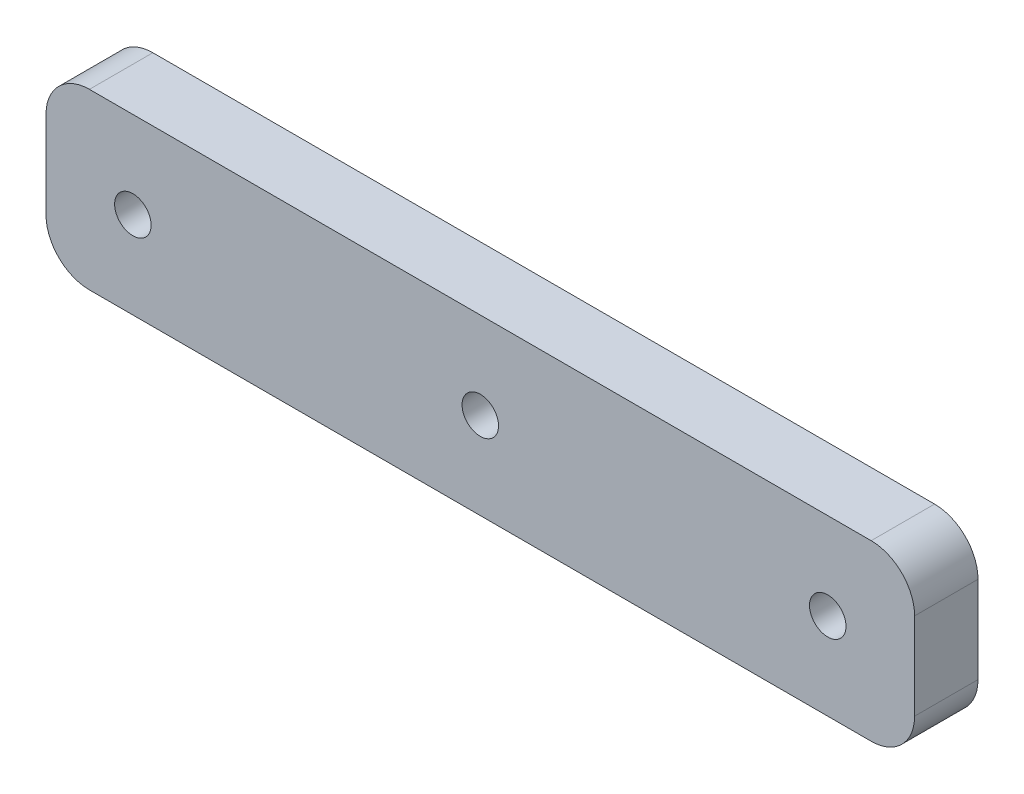
ISO-10303-21;
HEADER;
FILE_DESCRIPTION(('STEP AP214'),'2;1');
FILE_NAME('part.step','',(''),(''),'','','');
FILE_SCHEMA(('AUTOMOTIVE_DESIGN { 1 0 10303 214 1 1 1 1 }'));
ENDSEC;
DATA;
#1=APPLICATION_CONTEXT('core data for automotive mechanical design processes');
#2=APPLICATION_PROTOCOL_DEFINITION('international standard','automotive_design',2000,#1);
#3=PRODUCT_CONTEXT('',#1,'mechanical');
#4=PRODUCT('Part','Part','',(#3));
#5=PRODUCT_RELATED_PRODUCT_CATEGORY('part','',(#4));
#6=PRODUCT_DEFINITION_FORMATION('','',#4);
#7=PRODUCT_DEFINITION_CONTEXT('part definition',#1,'design');
#8=PRODUCT_DEFINITION('design','',#6,#7);
#9=PRODUCT_DEFINITION_SHAPE('','',#8);
#10=(LENGTH_UNIT() NAMED_UNIT(*) SI_UNIT(.MILLI.,.METRE.));
#11=(NAMED_UNIT(*) PLANE_ANGLE_UNIT() SI_UNIT($,.RADIAN.));
#12=(NAMED_UNIT(*) SI_UNIT($,.STERADIAN.) SOLID_ANGLE_UNIT());
#13=UNCERTAINTY_MEASURE_WITH_UNIT(LENGTH_MEASURE(1.E-05),#10,'distance_accuracy_value','');
#14=(GEOMETRIC_REPRESENTATION_CONTEXT(3) GLOBAL_UNCERTAINTY_ASSIGNED_CONTEXT((#13)) GLOBAL_UNIT_ASSIGNED_CONTEXT((#10,
#11,#12)) REPRESENTATION_CONTEXT('',''));
#15=CARTESIAN_POINT('',(0.,0.,0.));
#16=DIRECTION('',(0.,0.,1.));
#17=DIRECTION('',(1.,0.,0.));
#18=AXIS2_PLACEMENT_3D('',#15,#16,#17);
#19=CARTESIAN_POINT('',(0.,0.,7.3));
#20=DIRECTION('',(1.,0.,0.));
#21=DIRECTION('',(0.,0.,-1.));
#22=AXIS2_PLACEMENT_3D('',#19,#20,#21);
#23=PLANE('',#22);
#24=DIRECTION('',(0.,-1.,0.));
#25=VECTOR('',#24,1.);
#26=CARTESIAN_POINT('',(0.,0.,0.));
#27=LINE('',#26,#25);
#28=CARTESIAN_POINT('',(0.,15.,0.));
#29=VERTEX_POINT('',#28);
#30=CARTESIAN_POINT('',(0.,5.,0.));
#31=VERTEX_POINT('',#30);
#32=EDGE_CURVE('E165',#29,#31,#27,.T.);
#33=ORIENTED_EDGE('',*,*,#32,.T.);
#34=DIRECTION('',(0.,0.,-1.));
#35=VECTOR('',#34,1.);
#36=CARTESIAN_POINT('',(0.,5.,7.3));
#37=LINE('',#36,#35);
#38=CARTESIAN_POINT('',(0.,5.,7.3));
#39=VERTEX_POINT('',#38);
#40=EDGE_CURVE('E11',#31,#39,#37,.F.);
#41=ORIENTED_EDGE('',*,*,#40,.T.);
#42=DIRECTION('',(0.,-1.,0.));
#43=VECTOR('',#42,1.);
#44=CARTESIAN_POINT('',(0.,0.,7.3));
#45=LINE('',#44,#43);
#46=CARTESIAN_POINT('',(0.,15.,7.3));
#47=VERTEX_POINT('',#46);
#48=EDGE_CURVE('E133',#47,#39,#45,.T.);
#49=ORIENTED_EDGE('',*,*,#48,.F.);
#50=DIRECTION('',(0.,0.,-1.));
#51=VECTOR('',#50,1.);
#52=CARTESIAN_POINT('',(0.,15.,7.3));
#53=LINE('',#52,#51);
#54=EDGE_CURVE('E49',#47,#29,#53,.T.);
#55=ORIENTED_EDGE('',*,*,#54,.T.);
#56=EDGE_LOOP('',(#33,#41,#49,#55));
#57=FACE_BOUND('',#56,.T.);
#58=ADVANCED_FACE('F41',(#57),#23,.F.);
#59=CARTESIAN_POINT('',(0.,0.,7.3));
#60=DIRECTION('',(0.,1.,0.));
#61=DIRECTION('',(0.,0.,1.));
#62=AXIS2_PLACEMENT_3D('',#59,#60,#61);
#63=PLANE('',#62);
#64=DIRECTION('',(1.,0.,0.));
#65=VECTOR('',#64,1.);
#66=CARTESIAN_POINT('',(0.,0.,0.));
#67=LINE('',#66,#65);
#68=CARTESIAN_POINT('',(5.,0.,0.));
#69=VERTEX_POINT('',#68);
#70=CARTESIAN_POINT('',(95.,0.,0.));
#71=VERTEX_POINT('',#70);
#72=EDGE_CURVE('E138',#69,#71,#67,.T.);
#73=ORIENTED_EDGE('',*,*,#72,.T.);
#74=DIRECTION('',(0.,0.,-1.));
#75=VECTOR('',#74,1.);
#76=CARTESIAN_POINT('',(95.,0.,7.3));
#77=LINE('',#76,#75);
#78=CARTESIAN_POINT('',(95.,0.,7.3));
#79=VERTEX_POINT('',#78);
#80=EDGE_CURVE('E56',#71,#79,#77,.F.);
#81=ORIENTED_EDGE('',*,*,#80,.T.);
#82=DIRECTION('',(1.,0.,0.));
#83=VECTOR('',#82,1.);
#84=CARTESIAN_POINT('',(0.,0.,7.3));
#85=LINE('',#84,#83);
#86=CARTESIAN_POINT('',(5.,0.,7.3));
#87=VERTEX_POINT('',#86);
#88=EDGE_CURVE('E136',#87,#79,#85,.T.);
#89=ORIENTED_EDGE('',*,*,#88,.F.);
#90=DIRECTION('',(0.,0.,-1.));
#91=VECTOR('',#90,1.);
#92=CARTESIAN_POINT('',(5.,0.,7.3));
#93=LINE('',#92,#91);
#94=EDGE_CURVE('E157',#87,#69,#93,.T.);
#95=ORIENTED_EDGE('',*,*,#94,.T.);
#96=EDGE_LOOP('',(#73,#81,#89,#95));
#97=FACE_BOUND('',#96,.T.);
#98=ADVANCED_FACE('F212',(#97),#63,.F.);
#99=CARTESIAN_POINT('',(100.,0.,7.3));
#100=DIRECTION('',(-1.,0.,0.));
#101=DIRECTION('',(0.,0.,1.));
#102=AXIS2_PLACEMENT_3D('',#99,#100,#101);
#103=PLANE('',#102);
#104=DIRECTION('',(0.,1.,0.));
#105=VECTOR('',#104,1.);
#106=CARTESIAN_POINT('',(100.,0.,0.));
#107=LINE('',#106,#105);
#108=CARTESIAN_POINT('',(100.,5.,0.));
#109=VERTEX_POINT('',#108);
#110=CARTESIAN_POINT('',(100.,15.,0.));
#111=VERTEX_POINT('',#110);
#112=EDGE_CURVE('E134',#109,#111,#107,.T.);
#113=ORIENTED_EDGE('',*,*,#112,.T.);
#114=DIRECTION('',(0.,0.,-1.));
#115=VECTOR('',#114,1.);
#116=CARTESIAN_POINT('',(100.,15.,7.3));
#117=LINE('',#116,#115);
#118=CARTESIAN_POINT('',(100.,15.,7.3));
#119=VERTEX_POINT('',#118);
#120=EDGE_CURVE('E112',#111,#119,#117,.F.);
#121=ORIENTED_EDGE('',*,*,#120,.T.);
#122=DIRECTION('',(0.,1.,0.));
#123=VECTOR('',#122,1.);
#124=CARTESIAN_POINT('',(100.,0.,7.3));
#125=LINE('',#124,#123);
#126=CARTESIAN_POINT('',(100.,5.,7.3));
#127=VERTEX_POINT('',#126);
#128=EDGE_CURVE('E177',#127,#119,#125,.T.);
#129=ORIENTED_EDGE('',*,*,#128,.F.);
#130=DIRECTION('',(0.,0.,-1.));
#131=VECTOR('',#130,1.);
#132=CARTESIAN_POINT('',(100.,5.,7.3));
#133=LINE('',#132,#131);
#134=EDGE_CURVE('E117',#127,#109,#133,.T.);
#135=ORIENTED_EDGE('',*,*,#134,.T.);
#136=EDGE_LOOP('',(#113,#121,#129,#135));
#137=FACE_BOUND('',#136,.T.);
#138=ADVANCED_FACE('F209',(#137),#103,.F.);
#139=CARTESIAN_POINT('',(0.,20.,7.3));
#140=DIRECTION('',(0.,-1.,0.));
#141=DIRECTION('',(0.,0.,-1.));
#142=AXIS2_PLACEMENT_3D('',#139,#140,#141);
#143=PLANE('',#142);
#144=DIRECTION('',(-1.,0.,0.));
#145=VECTOR('',#144,1.);
#146=CARTESIAN_POINT('',(0.,20.,7.3));
#147=LINE('',#146,#145);
#148=CARTESIAN_POINT('',(95.,20.,7.3));
#149=VERTEX_POINT('',#148);
#150=CARTESIAN_POINT('',(5.,20.,7.3));
#151=VERTEX_POINT('',#150);
#152=EDGE_CURVE('E127',#149,#151,#147,.T.);
#153=ORIENTED_EDGE('',*,*,#152,.F.);
#154=DIRECTION('',(0.,0.,-1.));
#155=VECTOR('',#154,1.);
#156=CARTESIAN_POINT('',(95.,20.,7.3));
#157=LINE('',#156,#155);
#158=CARTESIAN_POINT('',(95.,20.,0.));
#159=VERTEX_POINT('',#158);
#160=EDGE_CURVE('E111',#149,#159,#157,.T.);
#161=ORIENTED_EDGE('',*,*,#160,.T.);
#162=DIRECTION('',(-1.,0.,0.));
#163=VECTOR('',#162,1.);
#164=CARTESIAN_POINT('',(0.,20.,0.));
#165=LINE('',#164,#163);
#166=CARTESIAN_POINT('',(5.,20.,0.));
#167=VERTEX_POINT('',#166);
#168=EDGE_CURVE('E124',#159,#167,#165,.T.);
#169=ORIENTED_EDGE('',*,*,#168,.T.);
#170=DIRECTION('',(0.,0.,-1.));
#171=VECTOR('',#170,1.);
#172=CARTESIAN_POINT('',(5.,20.,7.3));
#173=LINE('',#172,#171);
#174=EDGE_CURVE('E129',#167,#151,#173,.F.);
#175=ORIENTED_EDGE('',*,*,#174,.T.);
#176=EDGE_LOOP('',(#153,#161,#169,#175));
#177=FACE_BOUND('',#176,.T.);
#178=ADVANCED_FACE('F123',(#177),#143,.F.);
#179=CARTESIAN_POINT('',(0.,0.,7.3));
#180=DIRECTION('',(0.,0.,-1.));
#181=DIRECTION('',(-1.,0.,0.));
#182=AXIS2_PLACEMENT_3D('',#179,#180,#181);
#183=PLANE('',#182);
#184=CARTESIAN_POINT('',(10.,10.,7.3));
#185=DIRECTION('',(0.,0.,1.));
#186=DIRECTION('',(1.,0.,0.));
#187=AXIS2_PLACEMENT_3D('',#184,#185,#186);
#188=CIRCLE('',#187,2.1);
#189=CARTESIAN_POINT('',(12.1,10.,7.3));
#190=VERTEX_POINT('',#189);
#191=EDGE_CURVE('E173',#190,#190,#188,.T.);
#192=ORIENTED_EDGE('',*,*,#191,.F.);
#193=EDGE_LOOP('',(#192));
#194=FACE_BOUND('',#193,.T.);
#195=CARTESIAN_POINT('',(50.,10.,7.3));
#196=DIRECTION('',(0.,0.,1.));
#197=DIRECTION('',(1.,0.,0.));
#198=AXIS2_PLACEMENT_3D('',#195,#196,#197);
#199=CIRCLE('',#198,2.1);
#200=CARTESIAN_POINT('',(52.1,10.,7.3));
#201=VERTEX_POINT('',#200);
#202=EDGE_CURVE('E190',#201,#201,#199,.T.);
#203=ORIENTED_EDGE('',*,*,#202,.F.);
#204=EDGE_LOOP('',(#203));
#205=FACE_BOUND('',#204,.T.);
#206=CARTESIAN_POINT('',(90.,10.,7.3));
#207=DIRECTION('',(0.,0.,1.));
#208=DIRECTION('',(1.,0.,0.));
#209=AXIS2_PLACEMENT_3D('',#206,#207,#208);
#210=CIRCLE('',#209,2.1);
#211=CARTESIAN_POINT('',(92.1,10.,7.3));
#212=VERTEX_POINT('',#211);
#213=EDGE_CURVE('E184',#212,#212,#210,.T.);
#214=ORIENTED_EDGE('',*,*,#213,.F.);
#215=EDGE_LOOP('',(#214));
#216=FACE_BOUND('',#215,.T.);
#217=ORIENTED_EDGE('',*,*,#128,.T.);
#218=CARTESIAN_POINT('',(95.,15.,7.3));
#219=DIRECTION('',(0.,0.,-1.));
#220=DIRECTION('',(-1.,0.,0.));
#221=AXIS2_PLACEMENT_3D('',#218,#219,#220);
#222=CIRCLE('',#221,5.);
#223=EDGE_CURVE('E155',#119,#149,#222,.F.);
#224=ORIENTED_EDGE('',*,*,#223,.T.);
#225=ORIENTED_EDGE('',*,*,#152,.T.);
#226=CARTESIAN_POINT('',(5.,15.,7.3));
#227=DIRECTION('',(0.,0.,-1.));
#228=DIRECTION('',(-1.,0.,0.));
#229=AXIS2_PLACEMENT_3D('',#226,#227,#228);
#230=CIRCLE('',#229,5.);
#231=EDGE_CURVE('E150',#151,#47,#230,.F.);
#232=ORIENTED_EDGE('',*,*,#231,.T.);
#233=ORIENTED_EDGE('',*,*,#48,.T.);
#234=CARTESIAN_POINT('',(5.,5.,7.3));
#235=DIRECTION('',(0.,0.,-1.));
#236=DIRECTION('',(-1.,0.,0.));
#237=AXIS2_PLACEMENT_3D('',#234,#235,#236);
#238=CIRCLE('',#237,5.);
#239=EDGE_CURVE('E63',#39,#87,#238,.F.);
#240=ORIENTED_EDGE('',*,*,#239,.T.);
#241=ORIENTED_EDGE('',*,*,#88,.T.);
#242=CARTESIAN_POINT('',(95.,5.,7.3));
#243=DIRECTION('',(0.,0.,-1.));
#244=DIRECTION('',(-1.,0.,0.));
#245=AXIS2_PLACEMENT_3D('',#242,#243,#244);
#246=CIRCLE('',#245,5.);
#247=EDGE_CURVE('E153',#79,#127,#246,.F.);
#248=ORIENTED_EDGE('',*,*,#247,.T.);
#249=EDGE_LOOP('',(#217,#224,#225,#232,#233,#240,#241,#248));
#250=FACE_BOUND('',#249,.T.);
#251=ADVANCED_FACE('F198',(#194,#205,#216,#250),#183,.F.);
#252=CARTESIAN_POINT('',(0.,0.,0.));
#253=DIRECTION('',(0.,0.,-1.));
#254=DIRECTION('',(-1.,0.,0.));
#255=AXIS2_PLACEMENT_3D('',#252,#253,#254);
#256=PLANE('',#255);
#257=CARTESIAN_POINT('',(10.,10.,0.));
#258=DIRECTION('',(0.,0.,1.));
#259=DIRECTION('',(1.,0.,0.));
#260=AXIS2_PLACEMENT_3D('',#257,#258,#259);
#261=CIRCLE('',#260,2.1);
#262=CARTESIAN_POINT('',(12.1,10.,0.));
#263=VERTEX_POINT('',#262);
#264=EDGE_CURVE('E170',#263,#263,#261,.T.);
#265=ORIENTED_EDGE('',*,*,#264,.T.);
#266=EDGE_LOOP('',(#265));
#267=FACE_BOUND('',#266,.T.);
#268=CARTESIAN_POINT('',(50.,10.,0.));
#269=DIRECTION('',(0.,0.,1.));
#270=DIRECTION('',(1.,0.,0.));
#271=AXIS2_PLACEMENT_3D('',#268,#269,#270);
#272=CIRCLE('',#271,2.1);
#273=CARTESIAN_POINT('',(52.1,10.,0.));
#274=VERTEX_POINT('',#273);
#275=EDGE_CURVE('E187',#274,#274,#272,.T.);
#276=ORIENTED_EDGE('',*,*,#275,.T.);
#277=EDGE_LOOP('',(#276));
#278=FACE_BOUND('',#277,.T.);
#279=CARTESIAN_POINT('',(90.,10.,0.));
#280=DIRECTION('',(0.,0.,1.));
#281=DIRECTION('',(1.,0.,0.));
#282=AXIS2_PLACEMENT_3D('',#279,#280,#281);
#283=CIRCLE('',#282,2.1);
#284=CARTESIAN_POINT('',(92.1,10.,0.));
#285=VERTEX_POINT('',#284);
#286=EDGE_CURVE('E181',#285,#285,#283,.T.);
#287=ORIENTED_EDGE('',*,*,#286,.T.);
#288=EDGE_LOOP('',(#287));
#289=FACE_BOUND('',#288,.T.);
#290=ORIENTED_EDGE('',*,*,#168,.F.);
#291=CARTESIAN_POINT('',(95.,15.,0.));
#292=DIRECTION('',(0.,0.,-1.));
#293=DIRECTION('',(-1.,0.,0.));
#294=AXIS2_PLACEMENT_3D('',#291,#292,#293);
#295=CIRCLE('',#294,5.);
#296=EDGE_CURVE('E107',#159,#111,#295,.T.);
#297=ORIENTED_EDGE('',*,*,#296,.T.);
#298=ORIENTED_EDGE('',*,*,#112,.F.);
#299=CARTESIAN_POINT('',(95.,5.,0.));
#300=DIRECTION('',(0.,0.,-1.));
#301=DIRECTION('',(-1.,0.,0.));
#302=AXIS2_PLACEMENT_3D('',#299,#300,#301);
#303=CIRCLE('',#302,5.);
#304=EDGE_CURVE('E118',#109,#71,#303,.T.);
#305=ORIENTED_EDGE('',*,*,#304,.T.);
#306=ORIENTED_EDGE('',*,*,#72,.F.);
#307=CARTESIAN_POINT('',(5.,5.,0.));
#308=DIRECTION('',(0.,0.,-1.));
#309=DIRECTION('',(-1.,0.,0.));
#310=AXIS2_PLACEMENT_3D('',#307,#308,#309);
#311=CIRCLE('',#310,5.);
#312=EDGE_CURVE('E144',#69,#31,#311,.T.);
#313=ORIENTED_EDGE('',*,*,#312,.T.);
#314=ORIENTED_EDGE('',*,*,#32,.F.);
#315=CARTESIAN_POINT('',(5.,15.,0.));
#316=DIRECTION('',(0.,0.,-1.));
#317=DIRECTION('',(-1.,0.,0.));
#318=AXIS2_PLACEMENT_3D('',#315,#316,#317);
#319=CIRCLE('',#318,5.);
#320=EDGE_CURVE('E128',#29,#167,#319,.T.);
#321=ORIENTED_EDGE('',*,*,#320,.T.);
#322=EDGE_LOOP('',(#290,#297,#298,#305,#306,#313,#314,#321));
#323=FACE_BOUND('',#322,.T.);
#324=ADVANCED_FACE('F131',(#267,#278,#289,#323),#256,.T.);
#325=CARTESIAN_POINT('',(90.,10.,0.));
#326=DIRECTION('',(0.,0.,1.));
#327=DIRECTION('',(1.,0.,0.));
#328=AXIS2_PLACEMENT_3D('',#325,#326,#327);
#329=CYLINDRICAL_SURFACE('',#328,2.1);
#330=ORIENTED_EDGE('',*,*,#286,.F.);
#331=EDGE_LOOP('',(#330));
#332=FACE_BOUND('',#331,.T.);
#333=ORIENTED_EDGE('',*,*,#213,.T.);
#334=EDGE_LOOP('',(#333));
#335=FACE_BOUND('',#334,.T.);
#336=ADVANCED_FACE('F268',(#332,#335),#329,.F.);
#337=CARTESIAN_POINT('',(50.,10.,0.));
#338=DIRECTION('',(0.,0.,1.));
#339=DIRECTION('',(1.,0.,0.));
#340=AXIS2_PLACEMENT_3D('',#337,#338,#339);
#341=CYLINDRICAL_SURFACE('',#340,2.1);
#342=ORIENTED_EDGE('',*,*,#275,.F.);
#343=EDGE_LOOP('',(#342));
#344=FACE_BOUND('',#343,.T.);
#345=ORIENTED_EDGE('',*,*,#202,.T.);
#346=EDGE_LOOP('',(#345));
#347=FACE_BOUND('',#346,.T.);
#348=ADVANCED_FACE('F259',(#344,#347),#341,.F.);
#349=CARTESIAN_POINT('',(10.,10.,0.));
#350=DIRECTION('',(0.,0.,1.));
#351=DIRECTION('',(1.,0.,0.));
#352=AXIS2_PLACEMENT_3D('',#349,#350,#351);
#353=CYLINDRICAL_SURFACE('',#352,2.1);
#354=ORIENTED_EDGE('',*,*,#264,.F.);
#355=EDGE_LOOP('',(#354));
#356=FACE_BOUND('',#355,.T.);
#357=ORIENTED_EDGE('',*,*,#191,.T.);
#358=EDGE_LOOP('',(#357));
#359=FACE_BOUND('',#358,.T.);
#360=ADVANCED_FACE('F196',(#356,#359),#353,.F.);
#361=CARTESIAN_POINT('',(95.,15.,7.3));
#362=DIRECTION('',(0.,0.,-1.));
#363=DIRECTION('',(-1.,0.,0.));
#364=AXIS2_PLACEMENT_3D('',#361,#362,#363);
#365=CYLINDRICAL_SURFACE('',#364,5.);
#366=ORIENTED_EDGE('',*,*,#223,.F.);
#367=ORIENTED_EDGE('',*,*,#120,.F.);
#368=ORIENTED_EDGE('',*,*,#296,.F.);
#369=ORIENTED_EDGE('',*,*,#160,.F.);
#370=EDGE_LOOP('',(#366,#367,#368,#369));
#371=FACE_BOUND('',#370,.T.);
#372=ADVANCED_FACE('F110',(#371),#365,.T.);
#373=CARTESIAN_POINT('',(95.,5.,7.3));
#374=DIRECTION('',(0.,0.,-1.));
#375=DIRECTION('',(-1.,0.,0.));
#376=AXIS2_PLACEMENT_3D('',#373,#374,#375);
#377=CYLINDRICAL_SURFACE('',#376,5.);
#378=ORIENTED_EDGE('',*,*,#247,.F.);
#379=ORIENTED_EDGE('',*,*,#80,.F.);
#380=ORIENTED_EDGE('',*,*,#304,.F.);
#381=ORIENTED_EDGE('',*,*,#134,.F.);
#382=EDGE_LOOP('',(#378,#379,#380,#381));
#383=FACE_BOUND('',#382,.T.);
#384=ADVANCED_FACE('F211',(#383),#377,.T.);
#385=CARTESIAN_POINT('',(5.,5.,7.3));
#386=DIRECTION('',(0.,0.,-1.));
#387=DIRECTION('',(-1.,0.,0.));
#388=AXIS2_PLACEMENT_3D('',#385,#386,#387);
#389=CYLINDRICAL_SURFACE('',#388,5.);
#390=ORIENTED_EDGE('',*,*,#239,.F.);
#391=ORIENTED_EDGE('',*,*,#40,.F.);
#392=ORIENTED_EDGE('',*,*,#312,.F.);
#393=ORIENTED_EDGE('',*,*,#94,.F.);
#394=EDGE_LOOP('',(#390,#391,#392,#393));
#395=FACE_BOUND('',#394,.T.);
#396=ADVANCED_FACE('F215',(#395),#389,.T.);
#397=CARTESIAN_POINT('',(5.,15.,7.3));
#398=DIRECTION('',(0.,0.,-1.));
#399=DIRECTION('',(-1.,0.,0.));
#400=AXIS2_PLACEMENT_3D('',#397,#398,#399);
#401=CYLINDRICAL_SURFACE('',#400,5.);
#402=ORIENTED_EDGE('',*,*,#231,.F.);
#403=ORIENTED_EDGE('',*,*,#174,.F.);
#404=ORIENTED_EDGE('',*,*,#320,.F.);
#405=ORIENTED_EDGE('',*,*,#54,.F.);
#406=EDGE_LOOP('',(#402,#403,#404,#405));
#407=FACE_BOUND('',#406,.T.);
#408=ADVANCED_FACE('F43',(#407),#401,.T.);
#409=CLOSED_SHELL('',(#58,#98,#138,#178,#251,#324,#336,#348,#360,#372,#384,#396,#408));
#410=MANIFOLD_SOLID_BREP('B2',#409);
#411=ADVANCED_BREP_SHAPE_REPRESENTATION('',(#18,#410),#14);
#412=SHAPE_DEFINITION_REPRESENTATION(#9,#411);
ENDSEC;
END-ISO-10303-21;
